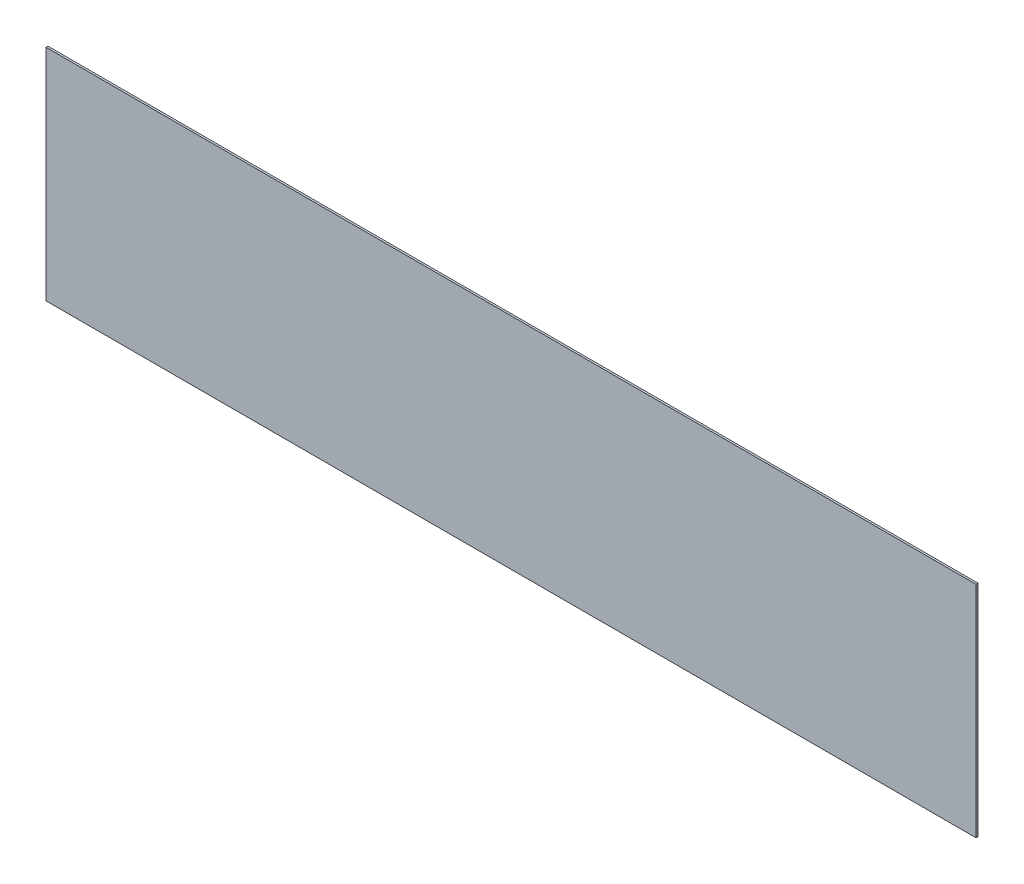
ISO-10303-21;
HEADER;
FILE_DESCRIPTION(('STEP AP214'),'2;1');
FILE_NAME('part.step','',(''),(''),'','','');
FILE_SCHEMA(('AUTOMOTIVE_DESIGN { 1 0 10303 214 1 1 1 1 }'));
ENDSEC;
DATA;
#1=APPLICATION_CONTEXT('core data for automotive mechanical design processes');
#2=APPLICATION_PROTOCOL_DEFINITION('international standard','automotive_design',2000,#1);
#3=PRODUCT_CONTEXT('',#1,'mechanical');
#4=PRODUCT('Part','Part','',(#3));
#5=PRODUCT_RELATED_PRODUCT_CATEGORY('part','',(#4));
#6=PRODUCT_DEFINITION_FORMATION('','',#4);
#7=PRODUCT_DEFINITION_CONTEXT('part definition',#1,'design');
#8=PRODUCT_DEFINITION('design','',#6,#7);
#9=PRODUCT_DEFINITION_SHAPE('','',#8);
#10=(LENGTH_UNIT() NAMED_UNIT(*) SI_UNIT(.MILLI.,.METRE.));
#11=(NAMED_UNIT(*) PLANE_ANGLE_UNIT() SI_UNIT($,.RADIAN.));
#12=(NAMED_UNIT(*) SI_UNIT($,.STERADIAN.) SOLID_ANGLE_UNIT());
#13=UNCERTAINTY_MEASURE_WITH_UNIT(LENGTH_MEASURE(1.E-05),#10,'distance_accuracy_value','');
#14=(GEOMETRIC_REPRESENTATION_CONTEXT(3) GLOBAL_UNCERTAINTY_ASSIGNED_CONTEXT((#13)) GLOBAL_UNIT_ASSIGNED_CONTEXT((#10,
#11,#12)) REPRESENTATION_CONTEXT('',''));
#15=CARTESIAN_POINT('',(0.,0.,0.));
#16=DIRECTION('',(0.,0.,1.));
#17=DIRECTION('',(1.,0.,0.));
#18=AXIS2_PLACEMENT_3D('',#15,#16,#17);
#19=CARTESIAN_POINT('',(720.,570.,491.));
#20=DIRECTION('',(-1.,0.,0.));
#21=DIRECTION('',(0.,0.,1.));
#22=AXIS2_PLACEMENT_3D('',#19,#20,#21);
#23=PLANE('',#22);
#24=DIRECTION('',(0.,-1.,0.));
#25=VECTOR('',#24,1.);
#26=CARTESIAN_POINT('',(720.,570.,494.));
#27=LINE('',#26,#25);
#28=CARTESIAN_POINT('',(720.,570.,494.));
#29=VERTEX_POINT('',#28);
#30=CARTESIAN_POINT('',(720.,230.,494.));
#31=VERTEX_POINT('',#30);
#32=EDGE_CURVE('E97',#29,#31,#27,.T.);
#33=ORIENTED_EDGE('',*,*,#32,.T.);
#34=DIRECTION('',(0.,0.,1.));
#35=VECTOR('',#34,1.);
#36=CARTESIAN_POINT('',(720.,230.,491.));
#37=LINE('',#36,#35);
#38=CARTESIAN_POINT('',(720.,230.,491.));
#39=VERTEX_POINT('',#38);
#40=EDGE_CURVE('E11',#39,#31,#37,.T.);
#41=ORIENTED_EDGE('',*,*,#40,.F.);
#42=DIRECTION('',(0.,-1.,0.));
#43=VECTOR('',#42,1.);
#44=CARTESIAN_POINT('',(720.,570.,491.));
#45=LINE('',#44,#43);
#46=CARTESIAN_POINT('',(720.,570.,491.));
#47=VERTEX_POINT('',#46);
#48=EDGE_CURVE('E85',#47,#39,#45,.T.);
#49=ORIENTED_EDGE('',*,*,#48,.F.);
#50=DIRECTION('',(0.,0.,1.));
#51=VECTOR('',#50,1.);
#52=CARTESIAN_POINT('',(720.,570.,491.));
#53=LINE('',#52,#51);
#54=EDGE_CURVE('E93',#47,#29,#53,.T.);
#55=ORIENTED_EDGE('',*,*,#54,.T.);
#56=EDGE_LOOP('',(#33,#41,#49,#55));
#57=FACE_BOUND('',#56,.T.);
#58=ADVANCED_FACE('F34',(#57),#23,.F.);
#59=CARTESIAN_POINT('',(720.,230.,491.));
#60=DIRECTION('',(0.,1.,0.));
#61=DIRECTION('',(0.,0.,1.));
#62=AXIS2_PLACEMENT_3D('',#59,#60,#61);
#63=PLANE('',#62);
#64=DIRECTION('',(-1.,0.,0.));
#65=VECTOR('',#64,1.);
#66=CARTESIAN_POINT('',(720.,230.,494.));
#67=LINE('',#66,#65);
#68=CARTESIAN_POINT('',(-720.,230.,494.));
#69=VERTEX_POINT('',#68);
#70=EDGE_CURVE('E89',#31,#69,#67,.T.);
#71=ORIENTED_EDGE('',*,*,#70,.T.);
#72=DIRECTION('',(0.,0.,1.));
#73=VECTOR('',#72,1.);
#74=CARTESIAN_POINT('',(-720.,230.,491.));
#75=LINE('',#74,#73);
#76=CARTESIAN_POINT('',(-720.,230.,491.));
#77=VERTEX_POINT('',#76);
#78=EDGE_CURVE('E42',#77,#69,#75,.T.);
#79=ORIENTED_EDGE('',*,*,#78,.F.);
#80=DIRECTION('',(-1.,0.,0.));
#81=VECTOR('',#80,1.);
#82=CARTESIAN_POINT('',(720.,230.,491.));
#83=LINE('',#82,#81);
#84=EDGE_CURVE('E80',#39,#77,#83,.T.);
#85=ORIENTED_EDGE('',*,*,#84,.F.);
#86=ORIENTED_EDGE('',*,*,#40,.T.);
#87=EDGE_LOOP('',(#71,#79,#85,#86));
#88=FACE_BOUND('',#87,.T.);
#89=ADVANCED_FACE('F88',(#88),#63,.F.);
#90=CARTESIAN_POINT('',(-720.,570.,491.));
#91=DIRECTION('',(1.,0.,0.));
#92=DIRECTION('',(0.,0.,-1.));
#93=AXIS2_PLACEMENT_3D('',#90,#91,#92);
#94=PLANE('',#93);
#95=DIRECTION('',(0.,1.,0.));
#96=VECTOR('',#95,1.);
#97=CARTESIAN_POINT('',(-720.,570.,494.));
#98=LINE('',#97,#96);
#99=CARTESIAN_POINT('',(-720.,570.,494.));
#100=VERTEX_POINT('',#99);
#101=EDGE_CURVE('E67',#69,#100,#98,.T.);
#102=ORIENTED_EDGE('',*,*,#101,.T.);
#103=DIRECTION('',(0.,0.,1.));
#104=VECTOR('',#103,1.);
#105=CARTESIAN_POINT('',(-720.,570.,491.));
#106=LINE('',#105,#104);
#107=CARTESIAN_POINT('',(-720.,570.,491.));
#108=VERTEX_POINT('',#107);
#109=EDGE_CURVE('E90',#108,#100,#106,.T.);
#110=ORIENTED_EDGE('',*,*,#109,.F.);
#111=DIRECTION('',(0.,1.,0.));
#112=VECTOR('',#111,1.);
#113=CARTESIAN_POINT('',(-720.,570.,491.));
#114=LINE('',#113,#112);
#115=EDGE_CURVE('E83',#77,#108,#114,.T.);
#116=ORIENTED_EDGE('',*,*,#115,.F.);
#117=ORIENTED_EDGE('',*,*,#78,.T.);
#118=EDGE_LOOP('',(#102,#110,#116,#117));
#119=FACE_BOUND('',#118,.T.);
#120=ADVANCED_FACE('F91',(#119),#94,.F.);
#121=CARTESIAN_POINT('',(720.,570.,491.));
#122=DIRECTION('',(0.,-1.,0.));
#123=DIRECTION('',(0.,0.,-1.));
#124=AXIS2_PLACEMENT_3D('',#121,#122,#123);
#125=PLANE('',#124);
#126=DIRECTION('',(1.,0.,0.));
#127=VECTOR('',#126,1.);
#128=CARTESIAN_POINT('',(720.,570.,494.));
#129=LINE('',#128,#127);
#130=EDGE_CURVE('E73',#100,#29,#129,.T.);
#131=ORIENTED_EDGE('',*,*,#130,.T.);
#132=ORIENTED_EDGE('',*,*,#54,.F.);
#133=DIRECTION('',(1.,0.,0.));
#134=VECTOR('',#133,1.);
#135=CARTESIAN_POINT('',(720.,570.,491.));
#136=LINE('',#135,#134);
#137=EDGE_CURVE('E50',#108,#47,#136,.T.);
#138=ORIENTED_EDGE('',*,*,#137,.F.);
#139=ORIENTED_EDGE('',*,*,#109,.T.);
#140=EDGE_LOOP('',(#131,#132,#138,#139));
#141=FACE_BOUND('',#140,.T.);
#142=ADVANCED_FACE('F104',(#141),#125,.F.);
#143=CARTESIAN_POINT('',(0.,0.,491.));
#144=DIRECTION('',(0.,0.,-1.));
#145=DIRECTION('',(0.,1.,0.));
#146=AXIS2_PLACEMENT_3D('',#143,#144,#145);
#147=PLANE('',#146);
#148=ORIENTED_EDGE('',*,*,#48,.T.);
#149=ORIENTED_EDGE('',*,*,#84,.T.);
#150=ORIENTED_EDGE('',*,*,#115,.T.);
#151=ORIENTED_EDGE('',*,*,#137,.T.);
#152=EDGE_LOOP('',(#148,#149,#150,#151));
#153=FACE_BOUND('',#152,.T.);
#154=ADVANCED_FACE('F81',(#153),#147,.T.);
#155=CARTESIAN_POINT('',(0.,0.,494.));
#156=DIRECTION('',(0.,0.,-1.));
#157=DIRECTION('',(0.,1.,0.));
#158=AXIS2_PLACEMENT_3D('',#155,#156,#157);
#159=PLANE('',#158);
#160=ORIENTED_EDGE('',*,*,#32,.F.);
#161=ORIENTED_EDGE('',*,*,#130,.F.);
#162=ORIENTED_EDGE('',*,*,#101,.F.);
#163=ORIENTED_EDGE('',*,*,#70,.F.);
#164=EDGE_LOOP('',(#160,#161,#162,#163));
#165=FACE_BOUND('',#164,.T.);
#166=ADVANCED_FACE('F107',(#165),#159,.F.);
#167=CLOSED_SHELL('',(#58,#89,#120,#142,#154,#166));
#168=MANIFOLD_SOLID_BREP('B2',#167);
#169=ADVANCED_BREP_SHAPE_REPRESENTATION('',(#18,#168),#14);
#170=SHAPE_DEFINITION_REPRESENTATION(#9,#169);
ENDSEC;
END-ISO-10303-21;
